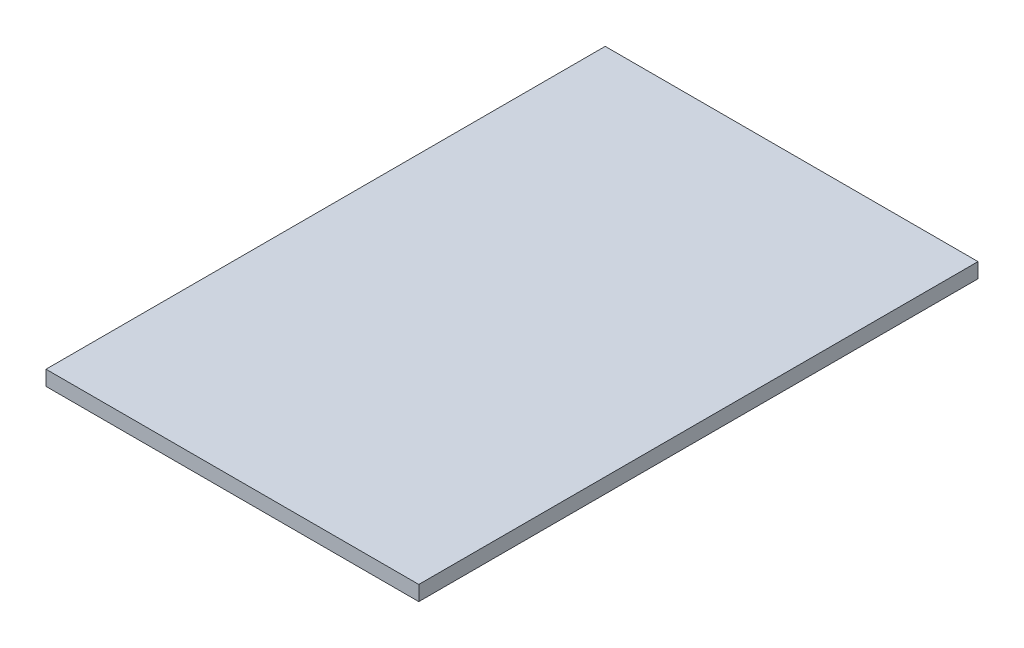
ISO-10303-21;
HEADER;
FILE_DESCRIPTION(('STEP AP214'),'2;1');
FILE_NAME('part.step','',(''),(''),'','','');
FILE_SCHEMA(('AUTOMOTIVE_DESIGN { 1 0 10303 214 1 1 1 1 }'));
ENDSEC;
DATA;
#1=APPLICATION_CONTEXT('core data for automotive mechanical design processes');
#2=APPLICATION_PROTOCOL_DEFINITION('international standard','automotive_design',2000,#1);
#3=PRODUCT_CONTEXT('',#1,'mechanical');
#4=PRODUCT('Part','Part','',(#3));
#5=PRODUCT_RELATED_PRODUCT_CATEGORY('part','',(#4));
#6=PRODUCT_DEFINITION_FORMATION('','',#4);
#7=PRODUCT_DEFINITION_CONTEXT('part definition',#1,'design');
#8=PRODUCT_DEFINITION('design','',#6,#7);
#9=PRODUCT_DEFINITION_SHAPE('','',#8);
#10=(LENGTH_UNIT() NAMED_UNIT(*) SI_UNIT(.MILLI.,.METRE.));
#11=(NAMED_UNIT(*) PLANE_ANGLE_UNIT() SI_UNIT($,.RADIAN.));
#12=(NAMED_UNIT(*) SI_UNIT($,.STERADIAN.) SOLID_ANGLE_UNIT());
#13=UNCERTAINTY_MEASURE_WITH_UNIT(LENGTH_MEASURE(1.E-05),#10,'distance_accuracy_value','');
#14=(GEOMETRIC_REPRESENTATION_CONTEXT(3) GLOBAL_UNCERTAINTY_ASSIGNED_CONTEXT((#13)) GLOBAL_UNIT_ASSIGNED_CONTEXT((#10,
#11,#12)) REPRESENTATION_CONTEXT('',''));
#15=CARTESIAN_POINT('',(0.,0.,0.));
#16=DIRECTION('',(0.,0.,1.));
#17=DIRECTION('',(1.,0.,0.));
#18=AXIS2_PLACEMENT_3D('',#15,#16,#17);
#19=CARTESIAN_POINT('',(0.,4.,0.));
#20=DIRECTION('',(1.,0.,0.));
#21=DIRECTION('',(0.,0.,-1.));
#22=AXIS2_PLACEMENT_3D('',#19,#20,#21);
#23=PLANE('',#22);
#24=DIRECTION('',(0.,0.,1.));
#25=VECTOR('',#24,1.);
#26=CARTESIAN_POINT('',(0.,0.,0.));
#27=LINE('',#26,#25);
#28=CARTESIAN_POINT('',(0.,0.,0.));
#29=VERTEX_POINT('',#28);
#30=CARTESIAN_POINT('',(0.,0.,150.));
#31=VERTEX_POINT('',#30);
#32=EDGE_CURVE('E111',#29,#31,#27,.T.);
#33=ORIENTED_EDGE('',*,*,#32,.T.);
#34=DIRECTION('',(0.,-1.,0.));
#35=VECTOR('',#34,1.);
#36=CARTESIAN_POINT('',(0.,4.,150.));
#37=LINE('',#36,#35);
#38=CARTESIAN_POINT('',(0.,4.,150.));
#39=VERTEX_POINT('',#38);
#40=EDGE_CURVE('E11',#39,#31,#37,.T.);
#41=ORIENTED_EDGE('',*,*,#40,.F.);
#42=DIRECTION('',(0.,0.,1.));
#43=VECTOR('',#42,1.);
#44=CARTESIAN_POINT('',(0.,4.,0.));
#45=LINE('',#44,#43);
#46=CARTESIAN_POINT('',(0.,4.,0.));
#47=VERTEX_POINT('',#46);
#48=EDGE_CURVE('E100',#47,#39,#45,.T.);
#49=ORIENTED_EDGE('',*,*,#48,.F.);
#50=DIRECTION('',(0.,-1.,0.));
#51=VECTOR('',#50,1.);
#52=CARTESIAN_POINT('',(0.,4.,0.));
#53=LINE('',#52,#51);
#54=EDGE_CURVE('E108',#47,#29,#53,.T.);
#55=ORIENTED_EDGE('',*,*,#54,.T.);
#56=EDGE_LOOP('',(#33,#41,#49,#55));
#57=FACE_BOUND('',#56,.T.);
#58=ADVANCED_FACE('F44',(#57),#23,.F.);
#59=CARTESIAN_POINT('',(0.,4.,150.));
#60=DIRECTION('',(0.,0.,-1.));
#61=DIRECTION('',(-1.,0.,0.));
#62=AXIS2_PLACEMENT_3D('',#59,#60,#61);
#63=PLANE('',#62);
#64=DIRECTION('',(1.,0.,0.));
#65=VECTOR('',#64,1.);
#66=CARTESIAN_POINT('',(0.,0.,150.));
#67=LINE('',#66,#65);
#68=CARTESIAN_POINT('',(100.,0.,150.));
#69=VERTEX_POINT('',#68);
#70=EDGE_CURVE('E105',#31,#69,#67,.T.);
#71=ORIENTED_EDGE('',*,*,#70,.T.);
#72=DIRECTION('',(0.,-1.,0.));
#73=VECTOR('',#72,1.);
#74=CARTESIAN_POINT('',(100.,4.,150.));
#75=LINE('',#74,#73);
#76=CARTESIAN_POINT('',(100.,4.,150.));
#77=VERTEX_POINT('',#76);
#78=EDGE_CURVE('E53',#77,#69,#75,.T.);
#79=ORIENTED_EDGE('',*,*,#78,.F.);
#80=DIRECTION('',(1.,0.,0.));
#81=VECTOR('',#80,1.);
#82=CARTESIAN_POINT('',(0.,4.,150.));
#83=LINE('',#82,#81);
#84=EDGE_CURVE('E95',#39,#77,#83,.T.);
#85=ORIENTED_EDGE('',*,*,#84,.F.);
#86=ORIENTED_EDGE('',*,*,#40,.T.);
#87=EDGE_LOOP('',(#71,#79,#85,#86));
#88=FACE_BOUND('',#87,.T.);
#89=ADVANCED_FACE('F102',(#88),#63,.F.);
#90=CARTESIAN_POINT('',(100.,4.,0.));
#91=DIRECTION('',(-1.,0.,0.));
#92=DIRECTION('',(0.,0.,1.));
#93=AXIS2_PLACEMENT_3D('',#90,#91,#92);
#94=PLANE('',#93);
#95=DIRECTION('',(0.,0.,-1.));
#96=VECTOR('',#95,1.);
#97=CARTESIAN_POINT('',(100.,0.,0.));
#98=LINE('',#97,#96);
#99=CARTESIAN_POINT('',(100.,0.,0.));
#100=VERTEX_POINT('',#99);
#101=EDGE_CURVE('E80',#69,#100,#98,.T.);
#102=ORIENTED_EDGE('',*,*,#101,.T.);
#103=DIRECTION('',(0.,-1.,0.));
#104=VECTOR('',#103,1.);
#105=CARTESIAN_POINT('',(100.,4.,0.));
#106=LINE('',#105,#104);
#107=CARTESIAN_POINT('',(100.,4.,0.));
#108=VERTEX_POINT('',#107);
#109=EDGE_CURVE('E101',#108,#100,#106,.T.);
#110=ORIENTED_EDGE('',*,*,#109,.F.);
#111=DIRECTION('',(0.,0.,-1.));
#112=VECTOR('',#111,1.);
#113=CARTESIAN_POINT('',(100.,4.,0.));
#114=LINE('',#113,#112);
#115=EDGE_CURVE('E94',#77,#108,#114,.T.);
#116=ORIENTED_EDGE('',*,*,#115,.F.);
#117=ORIENTED_EDGE('',*,*,#78,.T.);
#118=EDGE_LOOP('',(#102,#110,#116,#117));
#119=FACE_BOUND('',#118,.T.);
#120=ADVANCED_FACE('F103',(#119),#94,.F.);
#121=CARTESIAN_POINT('',(0.,4.,0.));
#122=DIRECTION('',(0.,0.,1.));
#123=DIRECTION('',(1.,0.,0.));
#124=AXIS2_PLACEMENT_3D('',#121,#122,#123);
#125=PLANE('',#124);
#126=DIRECTION('',(-1.,0.,0.));
#127=VECTOR('',#126,1.);
#128=CARTESIAN_POINT('',(0.,0.,0.));
#129=LINE('',#128,#127);
#130=EDGE_CURVE('E82',#100,#29,#129,.T.);
#131=ORIENTED_EDGE('',*,*,#130,.T.);
#132=ORIENTED_EDGE('',*,*,#54,.F.);
#133=DIRECTION('',(-1.,0.,0.));
#134=VECTOR('',#133,1.);
#135=CARTESIAN_POINT('',(0.,4.,0.));
#136=LINE('',#135,#134);
#137=EDGE_CURVE('E62',#108,#47,#136,.T.);
#138=ORIENTED_EDGE('',*,*,#137,.F.);
#139=ORIENTED_EDGE('',*,*,#109,.T.);
#140=EDGE_LOOP('',(#131,#132,#138,#139));
#141=FACE_BOUND('',#140,.T.);
#142=ADVANCED_FACE('F128',(#141),#125,.F.);
#143=CARTESIAN_POINT('',(0.,4.,0.));
#144=DIRECTION('',(0.,1.,0.));
#145=DIRECTION('',(0.,0.,1.));
#146=AXIS2_PLACEMENT_3D('',#143,#144,#145);
#147=PLANE('',#146);
#148=ORIENTED_EDGE('',*,*,#48,.T.);
#149=ORIENTED_EDGE('',*,*,#84,.T.);
#150=ORIENTED_EDGE('',*,*,#115,.T.);
#151=ORIENTED_EDGE('',*,*,#137,.T.);
#152=EDGE_LOOP('',(#148,#149,#150,#151));
#153=FACE_BOUND('',#152,.T.);
#154=ADVANCED_FACE('F93',(#153),#147,.T.);
#155=CARTESIAN_POINT('',(0.,0.,0.));
#156=DIRECTION('',(0.,1.,0.));
#157=DIRECTION('',(0.,0.,1.));
#158=AXIS2_PLACEMENT_3D('',#155,#156,#157);
#159=PLANE('',#158);
#160=ORIENTED_EDGE('',*,*,#32,.F.);
#161=ORIENTED_EDGE('',*,*,#130,.F.);
#162=ORIENTED_EDGE('',*,*,#101,.F.);
#163=ORIENTED_EDGE('',*,*,#70,.F.);
#164=EDGE_LOOP('',(#160,#161,#162,#163));
#165=FACE_BOUND('',#164,.T.);
#166=ADVANCED_FACE('F129',(#165),#159,.F.);
#167=CLOSED_SHELL('',(#58,#89,#120,#142,#154,#166));
#168=MANIFOLD_SOLID_BREP('B2',#167);
#169=ADVANCED_BREP_SHAPE_REPRESENTATION('',(#18,#168),#14);
#170=SHAPE_DEFINITION_REPRESENTATION(#9,#169);
ENDSEC;
END-ISO-10303-21;
